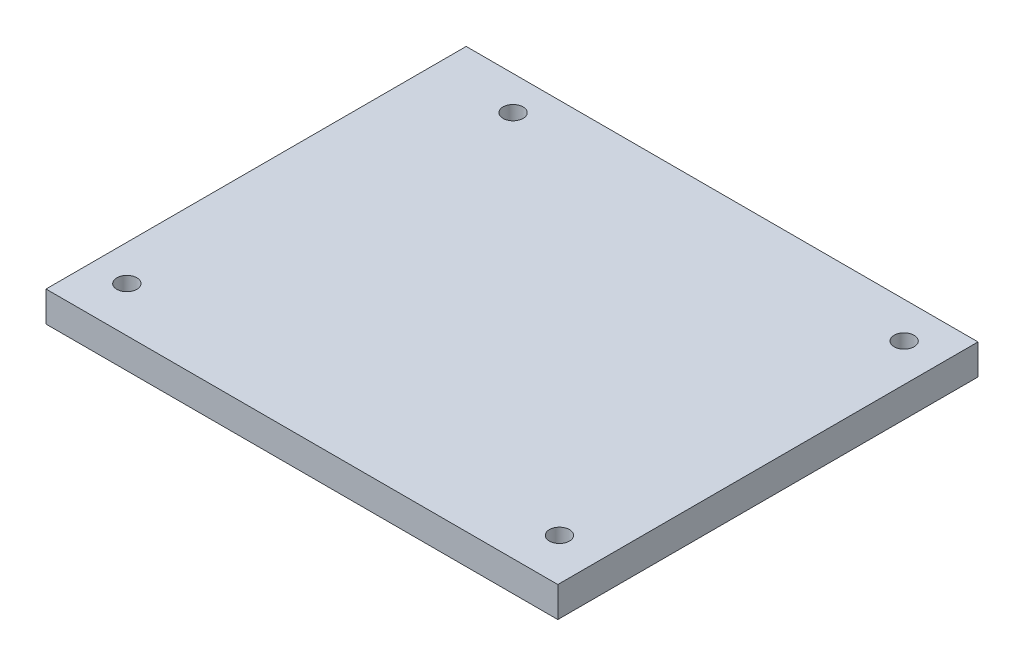
ISO-10303-21;
HEADER;
FILE_DESCRIPTION(('STEP AP214'),'2;1');
FILE_NAME('part.step','',(''),(''),'','','');
FILE_SCHEMA(('AUTOMOTIVE_DESIGN { 1 0 10303 214 1 1 1 1 }'));
ENDSEC;
DATA;
#1=APPLICATION_CONTEXT('core data for automotive mechanical design processes');
#2=APPLICATION_PROTOCOL_DEFINITION('international standard','automotive_design',2000,#1);
#3=PRODUCT_CONTEXT('',#1,'mechanical');
#4=PRODUCT('Part','Part','',(#3));
#5=PRODUCT_RELATED_PRODUCT_CATEGORY('part','',(#4));
#6=PRODUCT_DEFINITION_FORMATION('','',#4);
#7=PRODUCT_DEFINITION_CONTEXT('part definition',#1,'design');
#8=PRODUCT_DEFINITION('design','',#6,#7);
#9=PRODUCT_DEFINITION_SHAPE('','',#8);
#10=(LENGTH_UNIT() NAMED_UNIT(*) SI_UNIT(.MILLI.,.METRE.));
#11=(NAMED_UNIT(*) PLANE_ANGLE_UNIT() SI_UNIT($,.RADIAN.));
#12=(NAMED_UNIT(*) SI_UNIT($,.STERADIAN.) SOLID_ANGLE_UNIT());
#13=UNCERTAINTY_MEASURE_WITH_UNIT(LENGTH_MEASURE(1.E-05),#10,'distance_accuracy_value','');
#14=(GEOMETRIC_REPRESENTATION_CONTEXT(3) GLOBAL_UNCERTAINTY_ASSIGNED_CONTEXT((#13)) GLOBAL_UNIT_ASSIGNED_CONTEXT((#10,
#11,#12)) REPRESENTATION_CONTEXT('',''));
#15=CARTESIAN_POINT('',(0.,0.,0.));
#16=DIRECTION('',(0.,0.,1.));
#17=DIRECTION('',(1.,0.,0.));
#18=AXIS2_PLACEMENT_3D('',#15,#16,#17);
#19=CARTESIAN_POINT('',(0.,6.,0.));
#20=DIRECTION('',(0.,-1.,0.));
#21=DIRECTION('',(0.,0.,-1.));
#22=AXIS2_PLACEMENT_3D('',#19,#20,#21);
#23=PLANE('',#22);
#24=DIRECTION('',(0.,0.,-1.));
#25=VECTOR('',#24,1.);
#26=CARTESIAN_POINT('',(50.55,6.,41.5));
#27=LINE('',#26,#25);
#28=CARTESIAN_POINT('',(50.55,6.,41.5));
#29=VERTEX_POINT('',#28);
#30=CARTESIAN_POINT('',(50.55,6.,-41.5));
#31=VERTEX_POINT('',#30);
#32=EDGE_CURVE('E92',#29,#31,#27,.T.);
#33=ORIENTED_EDGE('',*,*,#32,.T.);
#34=DIRECTION('',(-1.,0.,0.));
#35=VECTOR('',#34,1.);
#36=CARTESIAN_POINT('',(-50.55,6.,-41.5));
#37=LINE('',#36,#35);
#38=CARTESIAN_POINT('',(-50.55,6.,-41.5));
#39=VERTEX_POINT('',#38);
#40=EDGE_CURVE('E87',#31,#39,#37,.T.);
#41=ORIENTED_EDGE('',*,*,#40,.T.);
#42=DIRECTION('',(0.,0.,1.));
#43=VECTOR('',#42,1.);
#44=CARTESIAN_POINT('',(-50.55,6.,41.5));
#45=LINE('',#44,#43);
#46=CARTESIAN_POINT('',(-50.55,6.,41.5));
#47=VERTEX_POINT('',#46);
#48=EDGE_CURVE('E90',#39,#47,#45,.T.);
#49=ORIENTED_EDGE('',*,*,#48,.T.);
#50=DIRECTION('',(1.,0.,0.));
#51=VECTOR('',#50,1.);
#52=CARTESIAN_POINT('',(-50.55,6.,41.5));
#53=LINE('',#52,#51);
#54=EDGE_CURVE('E57',#47,#29,#53,.T.);
#55=ORIENTED_EDGE('',*,*,#54,.T.);
#56=EDGE_LOOP('',(#33,#41,#49,#55));
#57=FACE_BOUND('',#56,.T.);
#58=CARTESIAN_POINT('',(43.1,6.,-34.36));
#59=DIRECTION('',(0.,1.,0.));
#60=DIRECTION('',(0.,0.,1.));
#61=AXIS2_PLACEMENT_3D('',#58,#59,#60);
#62=CIRCLE('',#61,1.98);
#63=CARTESIAN_POINT('',(43.1,6.,-32.38));
#64=VERTEX_POINT('',#63);
#65=EDGE_CURVE('E112',#64,#64,#62,.T.);
#66=ORIENTED_EDGE('',*,*,#65,.F.);
#67=EDGE_LOOP('',(#66));
#68=FACE_BOUND('',#67,.T.);
#69=CARTESIAN_POINT('',(-34.59,6.,-34.8));
#70=DIRECTION('',(0.,1.,0.));
#71=DIRECTION('',(0.,0.,1.));
#72=AXIS2_PLACEMENT_3D('',#69,#70,#71);
#73=CIRCLE('',#72,1.98);
#74=CARTESIAN_POINT('',(-34.59,6.,-32.82));
#75=VERTEX_POINT('',#74);
#76=EDGE_CURVE('E134',#75,#75,#73,.T.);
#77=ORIENTED_EDGE('',*,*,#76,.F.);
#78=EDGE_LOOP('',(#77));
#79=FACE_BOUND('',#78,.T.);
#80=CARTESIAN_POINT('',(42.3,6.,32.93));
#81=DIRECTION('',(0.,1.,0.));
#82=DIRECTION('',(0.,0.,1.));
#83=AXIS2_PLACEMENT_3D('',#80,#81,#82);
#84=CIRCLE('',#83,1.98);
#85=CARTESIAN_POINT('',(42.3,6.,34.91));
#86=VERTEX_POINT('',#85);
#87=EDGE_CURVE('E142',#86,#86,#84,.T.);
#88=ORIENTED_EDGE('',*,*,#87,.F.);
#89=EDGE_LOOP('',(#88));
#90=FACE_BOUND('',#89,.T.);
#91=CARTESIAN_POINT('',(-43.5,6.,32.58));
#92=DIRECTION('',(0.,1.,0.));
#93=DIRECTION('',(0.,0.,1.));
#94=AXIS2_PLACEMENT_3D('',#91,#92,#93);
#95=CIRCLE('',#94,1.98);
#96=CARTESIAN_POINT('',(-43.5,6.,34.56));
#97=VERTEX_POINT('',#96);
#98=EDGE_CURVE('E150',#97,#97,#95,.T.);
#99=ORIENTED_EDGE('',*,*,#98,.F.);
#100=EDGE_LOOP('',(#99));
#101=FACE_BOUND('',#100,.T.);
#102=ADVANCED_FACE('F39',(#57,#68,#79,#90,#101),#23,.F.);
#103=CARTESIAN_POINT('',(0.,0.,0.));
#104=DIRECTION('',(0.,-1.,0.));
#105=DIRECTION('',(0.,0.,-1.));
#106=AXIS2_PLACEMENT_3D('',#103,#104,#105);
#107=PLANE('',#106);
#108=CARTESIAN_POINT('',(42.3,0.,32.93));
#109=DIRECTION('',(0.,1.,0.));
#110=DIRECTION('',(0.,0.,1.));
#111=AXIS2_PLACEMENT_3D('',#108,#109,#110);
#112=CIRCLE('',#111,1.98);
#113=CARTESIAN_POINT('',(42.3,0.,34.91));
#114=VERTEX_POINT('',#113);
#115=EDGE_CURVE('E146',#114,#114,#112,.T.);
#116=ORIENTED_EDGE('',*,*,#115,.T.);
#117=EDGE_LOOP('',(#116));
#118=FACE_BOUND('',#117,.T.);
#119=CARTESIAN_POINT('',(43.1,0.,-34.36));
#120=DIRECTION('',(0.,1.,0.));
#121=DIRECTION('',(0.,0.,1.));
#122=AXIS2_PLACEMENT_3D('',#119,#120,#121);
#123=CIRCLE('',#122,1.98);
#124=CARTESIAN_POINT('',(43.1,0.,-32.38));
#125=VERTEX_POINT('',#124);
#126=EDGE_CURVE('E130',#125,#125,#123,.T.);
#127=ORIENTED_EDGE('',*,*,#126,.T.);
#128=EDGE_LOOP('',(#127));
#129=FACE_BOUND('',#128,.T.);
#130=DIRECTION('',(0.,0.,-1.));
#131=VECTOR('',#130,1.);
#132=CARTESIAN_POINT('',(50.55,0.,41.5));
#133=LINE('',#132,#131);
#134=CARTESIAN_POINT('',(50.55,0.,41.5));
#135=VERTEX_POINT('',#134);
#136=CARTESIAN_POINT('',(50.55,0.,-41.5));
#137=VERTEX_POINT('',#136);
#138=EDGE_CURVE('E108',#135,#137,#133,.T.);
#139=ORIENTED_EDGE('',*,*,#138,.F.);
#140=DIRECTION('',(1.,0.,0.));
#141=VECTOR('',#140,1.);
#142=CARTESIAN_POINT('',(-50.55,0.,41.5));
#143=LINE('',#142,#141);
#144=CARTESIAN_POINT('',(-50.55,0.,41.5));
#145=VERTEX_POINT('',#144);
#146=EDGE_CURVE('E80',#145,#135,#143,.T.);
#147=ORIENTED_EDGE('',*,*,#146,.F.);
#148=DIRECTION('',(0.,0.,1.));
#149=VECTOR('',#148,1.);
#150=CARTESIAN_POINT('',(-50.55,0.,41.5));
#151=LINE('',#150,#149);
#152=CARTESIAN_POINT('',(-50.55,0.,-41.5));
#153=VERTEX_POINT('',#152);
#154=EDGE_CURVE('E74',#153,#145,#151,.T.);
#155=ORIENTED_EDGE('',*,*,#154,.F.);
#156=DIRECTION('',(-1.,0.,0.));
#157=VECTOR('',#156,1.);
#158=CARTESIAN_POINT('',(-50.55,0.,-41.5));
#159=LINE('',#158,#157);
#160=EDGE_CURVE('E97',#137,#153,#159,.T.);
#161=ORIENTED_EDGE('',*,*,#160,.F.);
#162=EDGE_LOOP('',(#139,#147,#155,#161));
#163=FACE_BOUND('',#162,.T.);
#164=CARTESIAN_POINT('',(-34.59,0.,-34.8));
#165=DIRECTION('',(0.,1.,0.));
#166=DIRECTION('',(0.,0.,1.));
#167=AXIS2_PLACEMENT_3D('',#164,#165,#166);
#168=CIRCLE('',#167,1.98);
#169=CARTESIAN_POINT('',(-34.59,0.,-32.82));
#170=VERTEX_POINT('',#169);
#171=EDGE_CURVE('E138',#170,#170,#168,.T.);
#172=ORIENTED_EDGE('',*,*,#171,.T.);
#173=EDGE_LOOP('',(#172));
#174=FACE_BOUND('',#173,.T.);
#175=CARTESIAN_POINT('',(-43.5,0.,32.58));
#176=DIRECTION('',(0.,1.,0.));
#177=DIRECTION('',(0.,0.,1.));
#178=AXIS2_PLACEMENT_3D('',#175,#176,#177);
#179=CIRCLE('',#178,1.98);
#180=CARTESIAN_POINT('',(-43.5,0.,34.56));
#181=VERTEX_POINT('',#180);
#182=EDGE_CURVE('E154',#181,#181,#179,.T.);
#183=ORIENTED_EDGE('',*,*,#182,.T.);
#184=EDGE_LOOP('',(#183));
#185=FACE_BOUND('',#184,.T.);
#186=ADVANCED_FACE('F125',(#118,#129,#163,#174,#185),#107,.T.);
#187=CARTESIAN_POINT('',(50.55,6.,41.5));
#188=DIRECTION('',(-1.,0.,0.));
#189=DIRECTION('',(0.,0.,1.));
#190=AXIS2_PLACEMENT_3D('',#187,#188,#189);
#191=PLANE('',#190);
#192=ORIENTED_EDGE('',*,*,#138,.T.);
#193=DIRECTION('',(0.,-1.,0.));
#194=VECTOR('',#193,1.);
#195=CARTESIAN_POINT('',(50.55,6.,-41.5));
#196=LINE('',#195,#194);
#197=EDGE_CURVE('E11',#31,#137,#196,.T.);
#198=ORIENTED_EDGE('',*,*,#197,.F.);
#199=ORIENTED_EDGE('',*,*,#32,.F.);
#200=DIRECTION('',(0.,-1.,0.));
#201=VECTOR('',#200,1.);
#202=CARTESIAN_POINT('',(50.55,6.,41.5));
#203=LINE('',#202,#201);
#204=EDGE_CURVE('E104',#29,#135,#203,.T.);
#205=ORIENTED_EDGE('',*,*,#204,.T.);
#206=EDGE_LOOP('',(#192,#198,#199,#205));
#207=FACE_BOUND('',#206,.T.);
#208=ADVANCED_FACE('F41',(#207),#191,.F.);
#209=CARTESIAN_POINT('',(-50.55,6.,-41.5));
#210=DIRECTION('',(0.,0.,1.));
#211=DIRECTION('',(1.,0.,0.));
#212=AXIS2_PLACEMENT_3D('',#209,#210,#211);
#213=PLANE('',#212);
#214=ORIENTED_EDGE('',*,*,#160,.T.);
#215=DIRECTION('',(0.,-1.,0.));
#216=VECTOR('',#215,1.);
#217=CARTESIAN_POINT('',(-50.55,6.,-41.5));
#218=LINE('',#217,#216);
#219=EDGE_CURVE('E49',#39,#153,#218,.T.);
#220=ORIENTED_EDGE('',*,*,#219,.F.);
#221=ORIENTED_EDGE('',*,*,#40,.F.);
#222=ORIENTED_EDGE('',*,*,#197,.T.);
#223=EDGE_LOOP('',(#214,#220,#221,#222));
#224=FACE_BOUND('',#223,.T.);
#225=ADVANCED_FACE('F96',(#224),#213,.F.);
#226=CARTESIAN_POINT('',(-50.55,6.,41.5));
#227=DIRECTION('',(1.,0.,0.));
#228=DIRECTION('',(0.,0.,-1.));
#229=AXIS2_PLACEMENT_3D('',#226,#227,#228);
#230=PLANE('',#229);
#231=ORIENTED_EDGE('',*,*,#154,.T.);
#232=DIRECTION('',(0.,-1.,0.));
#233=VECTOR('',#232,1.);
#234=CARTESIAN_POINT('',(-50.55,6.,41.5));
#235=LINE('',#234,#233);
#236=EDGE_CURVE('E99',#47,#145,#235,.T.);
#237=ORIENTED_EDGE('',*,*,#236,.F.);
#238=ORIENTED_EDGE('',*,*,#48,.F.);
#239=ORIENTED_EDGE('',*,*,#219,.T.);
#240=EDGE_LOOP('',(#231,#237,#238,#239));
#241=FACE_BOUND('',#240,.T.);
#242=ADVANCED_FACE('F100',(#241),#230,.F.);
#243=CARTESIAN_POINT('',(-50.55,6.,41.5));
#244=DIRECTION('',(0.,0.,-1.));
#245=DIRECTION('',(-1.,0.,0.));
#246=AXIS2_PLACEMENT_3D('',#243,#244,#245);
#247=PLANE('',#246);
#248=ORIENTED_EDGE('',*,*,#146,.T.);
#249=ORIENTED_EDGE('',*,*,#204,.F.);
#250=ORIENTED_EDGE('',*,*,#54,.F.);
#251=ORIENTED_EDGE('',*,*,#236,.T.);
#252=EDGE_LOOP('',(#248,#249,#250,#251));
#253=FACE_BOUND('',#252,.T.);
#254=ADVANCED_FACE('F122',(#253),#247,.F.);
#255=CARTESIAN_POINT('',(43.1,6.,-34.36));
#256=DIRECTION('',(0.,-1.,0.));
#257=DIRECTION('',(0.,0.,-1.));
#258=AXIS2_PLACEMENT_3D('',#255,#256,#257);
#259=CYLINDRICAL_SURFACE('',#258,1.98);
#260=ORIENTED_EDGE('',*,*,#65,.T.);
#261=EDGE_LOOP('',(#260));
#262=FACE_BOUND('',#261,.T.);
#263=ORIENTED_EDGE('',*,*,#126,.F.);
#264=EDGE_LOOP('',(#263));
#265=FACE_BOUND('',#264,.T.);
#266=ADVANCED_FACE('F173',(#262,#265),#259,.F.);
#267=CARTESIAN_POINT('',(-34.59,6.,-34.8));
#268=DIRECTION('',(0.,-1.,0.));
#269=DIRECTION('',(0.,0.,-1.));
#270=AXIS2_PLACEMENT_3D('',#267,#268,#269);
#271=CYLINDRICAL_SURFACE('',#270,1.98);
#272=ORIENTED_EDGE('',*,*,#76,.T.);
#273=EDGE_LOOP('',(#272));
#274=FACE_BOUND('',#273,.T.);
#275=ORIENTED_EDGE('',*,*,#171,.F.);
#276=EDGE_LOOP('',(#275));
#277=FACE_BOUND('',#276,.T.);
#278=ADVANCED_FACE('F219',(#274,#277),#271,.F.);
#279=CARTESIAN_POINT('',(42.3,6.,32.93));
#280=DIRECTION('',(0.,-1.,0.));
#281=DIRECTION('',(0.,0.,-1.));
#282=AXIS2_PLACEMENT_3D('',#279,#280,#281);
#283=CYLINDRICAL_SURFACE('',#282,1.98);
#284=ORIENTED_EDGE('',*,*,#87,.T.);
#285=EDGE_LOOP('',(#284));
#286=FACE_BOUND('',#285,.T.);
#287=ORIENTED_EDGE('',*,*,#115,.F.);
#288=EDGE_LOOP('',(#287));
#289=FACE_BOUND('',#288,.T.);
#290=ADVANCED_FACE('F227',(#286,#289),#283,.F.);
#291=CARTESIAN_POINT('',(-43.5,6.,32.58));
#292=DIRECTION('',(0.,-1.,0.));
#293=DIRECTION('',(0.,0.,-1.));
#294=AXIS2_PLACEMENT_3D('',#291,#292,#293);
#295=CYLINDRICAL_SURFACE('',#294,1.98);
#296=ORIENTED_EDGE('',*,*,#98,.T.);
#297=EDGE_LOOP('',(#296));
#298=FACE_BOUND('',#297,.T.);
#299=ORIENTED_EDGE('',*,*,#182,.F.);
#300=EDGE_LOOP('',(#299));
#301=FACE_BOUND('',#300,.T.);
#302=ADVANCED_FACE('F162',(#298,#301),#295,.F.);
#303=CLOSED_SHELL('',(#102,#186,#208,#225,#242,#254,#266,#278,#290,#302));
#304=MANIFOLD_SOLID_BREP('B2',#303);
#305=ADVANCED_BREP_SHAPE_REPRESENTATION('',(#18,#304),#14);
#306=SHAPE_DEFINITION_REPRESENTATION(#9,#305);
ENDSEC;
END-ISO-10303-21;
